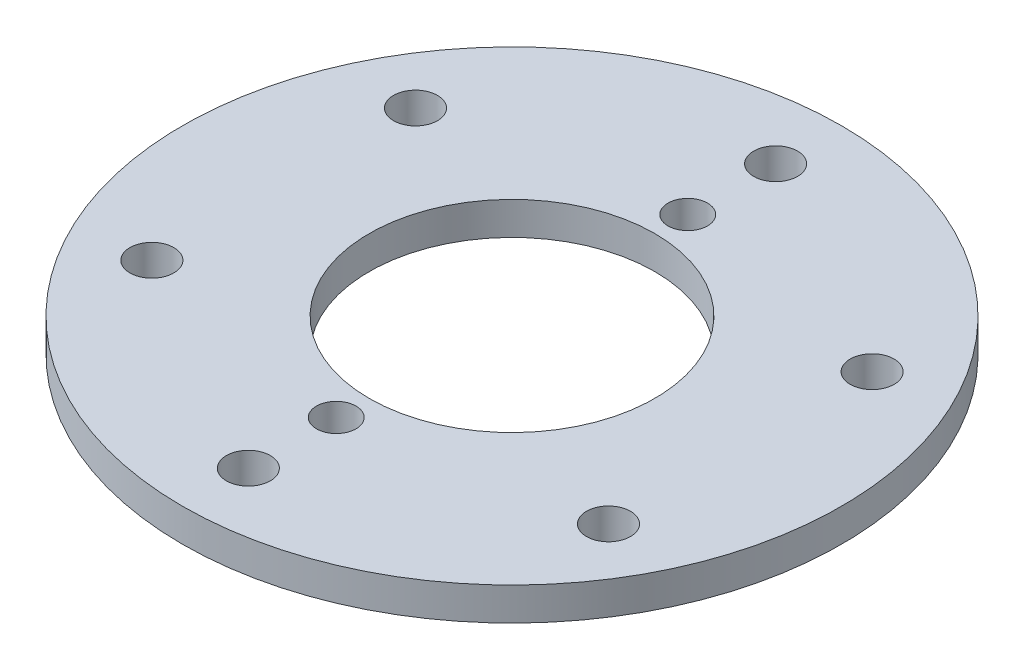
ISO-10303-21;
HEADER;
FILE_DESCRIPTION(('STEP AP214'),'2;1');
FILE_NAME('part.step','',(''),(''),'','','');
FILE_SCHEMA(('AUTOMOTIVE_DESIGN { 1 0 10303 214 1 1 1 1 }'));
ENDSEC;
DATA;
#1=APPLICATION_CONTEXT('core data for automotive mechanical design processes');
#2=APPLICATION_PROTOCOL_DEFINITION('international standard','automotive_design',2000,#1);
#3=PRODUCT_CONTEXT('',#1,'mechanical');
#4=PRODUCT('Part','Part','',(#3));
#5=PRODUCT_RELATED_PRODUCT_CATEGORY('part','',(#4));
#6=PRODUCT_DEFINITION_FORMATION('','',#4);
#7=PRODUCT_DEFINITION_CONTEXT('part definition',#1,'design');
#8=PRODUCT_DEFINITION('design','',#6,#7);
#9=PRODUCT_DEFINITION_SHAPE('','',#8);
#10=(LENGTH_UNIT() NAMED_UNIT(*) SI_UNIT(.MILLI.,.METRE.));
#11=(NAMED_UNIT(*) PLANE_ANGLE_UNIT() SI_UNIT($,.RADIAN.));
#12=(NAMED_UNIT(*) SI_UNIT($,.STERADIAN.) SOLID_ANGLE_UNIT());
#13=UNCERTAINTY_MEASURE_WITH_UNIT(LENGTH_MEASURE(1.E-05),#10,'distance_accuracy_value','');
#14=(GEOMETRIC_REPRESENTATION_CONTEXT(3) GLOBAL_UNCERTAINTY_ASSIGNED_CONTEXT((#13)) GLOBAL_UNIT_ASSIGNED_CONTEXT((#10,
#11,#12)) REPRESENTATION_CONTEXT('',''));
#15=CARTESIAN_POINT('',(0.,0.,0.));
#16=DIRECTION('',(0.,0.,1.));
#17=DIRECTION('',(1.,0.,0.));
#18=AXIS2_PLACEMENT_3D('',#15,#16,#17);
#19=CARTESIAN_POINT('',(0.,15.,0.));
#20=DIRECTION('',(0.,1.,0.));
#21=DIRECTION('',(0.,0.,1.));
#22=AXIS2_PLACEMENT_3D('',#19,#20,#21);
#23=PLANE('',#22);
#24=CARTESIAN_POINT('',(-103.923048454133,15.,-60.));
#25=DIRECTION('',(0.,1.,0.));
#26=DIRECTION('',(0.,0.,1.));
#27=AXIS2_PLACEMENT_3D('',#24,#25,#26);
#28=CIRCLE('',#27,9.99999999999999);
#29=CARTESIAN_POINT('',(-103.923048454133,15.,-50.));
#30=VERTEX_POINT('',#29);
#31=EDGE_CURVE('E89',#30,#30,#28,.T.);
#32=ORIENTED_EDGE('',*,*,#31,.F.);
#33=EDGE_LOOP('',(#32));
#34=FACE_BOUND('',#33,.T.);
#35=CARTESIAN_POINT('',(0.,15.,120.));
#36=DIRECTION('',(0.,1.,0.));
#37=DIRECTION('',(0.,0.,1.));
#38=AXIS2_PLACEMENT_3D('',#35,#36,#37);
#39=CIRCLE('',#38,9.99999999999999);
#40=CARTESIAN_POINT('',(0.,15.,130.));
#41=VERTEX_POINT('',#40);
#42=EDGE_CURVE('E77',#41,#41,#39,.T.);
#43=ORIENTED_EDGE('',*,*,#42,.F.);
#44=EDGE_LOOP('',(#43));
#45=FACE_BOUND('',#44,.T.);
#46=CARTESIAN_POINT('',(103.923048454133,15.,-60.));
#47=DIRECTION('',(0.,1.,0.));
#48=DIRECTION('',(0.,0.,1.));
#49=AXIS2_PLACEMENT_3D('',#46,#47,#48);
#50=CIRCLE('',#49,9.99999999999999);
#51=CARTESIAN_POINT('',(103.923048454133,15.,-50.));
#52=VERTEX_POINT('',#51);
#53=EDGE_CURVE('E65',#52,#52,#50,.T.);
#54=ORIENTED_EDGE('',*,*,#53,.F.);
#55=EDGE_LOOP('',(#54));
#56=FACE_BOUND('',#55,.T.);
#57=CARTESIAN_POINT('',(0.,15.,-120.));
#58=DIRECTION('',(0.,1.,0.));
#59=DIRECTION('',(0.,0.,1.));
#60=AXIS2_PLACEMENT_3D('',#57,#58,#59);
#61=CIRCLE('',#60,10.);
#62=CARTESIAN_POINT('',(0.,15.,-110.));
#63=VERTEX_POINT('',#62);
#64=EDGE_CURVE('E53',#63,#63,#61,.T.);
#65=ORIENTED_EDGE('',*,*,#64,.F.);
#66=EDGE_LOOP('',(#65));
#67=FACE_BOUND('',#66,.T.);
#68=CARTESIAN_POINT('',(0.,15.,0.));
#69=DIRECTION('',(0.,1.,0.));
#70=DIRECTION('',(0.,0.,1.));
#71=AXIS2_PLACEMENT_3D('',#68,#69,#70);
#72=CIRCLE('',#71,150.);
#73=CARTESIAN_POINT('',(0.,15.,150.));
#74=VERTEX_POINT('',#73);
#75=EDGE_CURVE('E10',#74,#74,#72,.T.);
#76=ORIENTED_EDGE('',*,*,#75,.T.);
#77=EDGE_LOOP('',(#76));
#78=FACE_BOUND('',#77,.T.);
#79=CARTESIAN_POINT('',(0.,15.,0.));
#80=DIRECTION('',(0.,1.,0.));
#81=DIRECTION('',(0.,0.,1.));
#82=AXIS2_PLACEMENT_3D('',#79,#80,#81);
#83=CIRCLE('',#82,65.);
#84=CARTESIAN_POINT('',(0.,15.,65.));
#85=VERTEX_POINT('',#84);
#86=EDGE_CURVE('E48',#85,#85,#83,.T.);
#87=ORIENTED_EDGE('',*,*,#86,.F.);
#88=EDGE_LOOP('',(#87));
#89=FACE_BOUND('',#88,.T.);
#90=CARTESIAN_POINT('',(0.,15.,80.));
#91=DIRECTION('',(0.,1.,0.));
#92=DIRECTION('',(0.,0.,-1.));
#93=AXIS2_PLACEMENT_3D('',#90,#91,#92);
#94=CIRCLE('',#93,9.);
#95=CARTESIAN_POINT('',(0.,15.,71.));
#96=VERTEX_POINT('',#95);
#97=EDGE_CURVE('E59',#96,#96,#94,.T.);
#98=ORIENTED_EDGE('',*,*,#97,.F.);
#99=EDGE_LOOP('',(#98));
#100=FACE_BOUND('',#99,.T.);
#101=CARTESIAN_POINT('',(103.923048454133,15.,60.));
#102=DIRECTION('',(0.,1.,0.));
#103=DIRECTION('',(0.,0.,1.));
#104=AXIS2_PLACEMENT_3D('',#101,#102,#103);
#105=CIRCLE('',#104,9.99999999999999);
#106=CARTESIAN_POINT('',(103.923048454133,15.,70.));
#107=VERTEX_POINT('',#106);
#108=EDGE_CURVE('E71',#107,#107,#105,.T.);
#109=ORIENTED_EDGE('',*,*,#108,.F.);
#110=EDGE_LOOP('',(#109));
#111=FACE_BOUND('',#110,.T.);
#112=CARTESIAN_POINT('',(-103.923048454133,15.,60.0000000000001));
#113=DIRECTION('',(0.,1.,0.));
#114=DIRECTION('',(0.,0.,1.));
#115=AXIS2_PLACEMENT_3D('',#112,#113,#114);
#116=CIRCLE('',#115,9.99999999999998);
#117=CARTESIAN_POINT('',(-103.923048454133,15.,70.));
#118=VERTEX_POINT('',#117);
#119=EDGE_CURVE('E83',#118,#118,#116,.T.);
#120=ORIENTED_EDGE('',*,*,#119,.F.);
#121=EDGE_LOOP('',(#120));
#122=FACE_BOUND('',#121,.T.);
#123=CARTESIAN_POINT('',(0.,15.,-80.));
#124=DIRECTION('',(0.,1.,0.));
#125=DIRECTION('',(0.,0.,1.));
#126=AXIS2_PLACEMENT_3D('',#123,#124,#125);
#127=CIRCLE('',#126,9.);
#128=CARTESIAN_POINT('',(0.,15.,-71.));
#129=VERTEX_POINT('',#128);
#130=EDGE_CURVE('E95',#129,#129,#127,.T.);
#131=ORIENTED_EDGE('',*,*,#130,.F.);
#132=EDGE_LOOP('',(#131));
#133=FACE_BOUND('',#132,.T.);
#134=ADVANCED_FACE('F37',(#34,#45,#56,#67,#78,#89,#100,#111,#122,#133),#23,.T.);
#135=CARTESIAN_POINT('',(0.,0.,0.));
#136=DIRECTION('',(0.,1.,0.));
#137=DIRECTION('',(0.,0.,1.));
#138=AXIS2_PLACEMENT_3D('',#135,#136,#137);
#139=PLANE('',#138);
#140=CARTESIAN_POINT('',(0.,0.,0.));
#141=DIRECTION('',(0.,1.,0.));
#142=DIRECTION('',(0.,0.,1.));
#143=AXIS2_PLACEMENT_3D('',#140,#141,#142);
#144=CIRCLE('',#143,150.);
#145=CARTESIAN_POINT('',(0.,0.,150.));
#146=VERTEX_POINT('',#145);
#147=EDGE_CURVE('E41',#146,#146,#144,.T.);
#148=ORIENTED_EDGE('',*,*,#147,.F.);
#149=EDGE_LOOP('',(#148));
#150=FACE_BOUND('',#149,.T.);
#151=CARTESIAN_POINT('',(0.,0.,0.));
#152=DIRECTION('',(0.,1.,0.));
#153=DIRECTION('',(0.,0.,1.));
#154=AXIS2_PLACEMENT_3D('',#151,#152,#153);
#155=CIRCLE('',#154,65.);
#156=CARTESIAN_POINT('',(0.,0.,65.));
#157=VERTEX_POINT('',#156);
#158=EDGE_CURVE('E50',#157,#157,#155,.T.);
#159=ORIENTED_EDGE('',*,*,#158,.T.);
#160=EDGE_LOOP('',(#159));
#161=FACE_BOUND('',#160,.T.);
#162=CARTESIAN_POINT('',(0.,0.,-120.));
#163=DIRECTION('',(0.,1.,0.));
#164=DIRECTION('',(0.,0.,1.));
#165=AXIS2_PLACEMENT_3D('',#162,#163,#164);
#166=CIRCLE('',#165,10.);
#167=CARTESIAN_POINT('',(0.,0.,-110.));
#168=VERTEX_POINT('',#167);
#169=EDGE_CURVE('E56',#168,#168,#166,.T.);
#170=ORIENTED_EDGE('',*,*,#169,.T.);
#171=EDGE_LOOP('',(#170));
#172=FACE_BOUND('',#171,.T.);
#173=CARTESIAN_POINT('',(0.,0.,80.));
#174=DIRECTION('',(0.,1.,0.));
#175=DIRECTION('',(0.,0.,-1.));
#176=AXIS2_PLACEMENT_3D('',#173,#174,#175);
#177=CIRCLE('',#176,9.);
#178=CARTESIAN_POINT('',(0.,0.,71.));
#179=VERTEX_POINT('',#178);
#180=EDGE_CURVE('E62',#179,#179,#177,.T.);
#181=ORIENTED_EDGE('',*,*,#180,.T.);
#182=EDGE_LOOP('',(#181));
#183=FACE_BOUND('',#182,.T.);
#184=CARTESIAN_POINT('',(103.923048454133,0.,-60.));
#185=DIRECTION('',(0.,1.,0.));
#186=DIRECTION('',(0.,0.,1.));
#187=AXIS2_PLACEMENT_3D('',#184,#185,#186);
#188=CIRCLE('',#187,9.99999999999999);
#189=CARTESIAN_POINT('',(103.923048454133,0.,-50.));
#190=VERTEX_POINT('',#189);
#191=EDGE_CURVE('E68',#190,#190,#188,.T.);
#192=ORIENTED_EDGE('',*,*,#191,.T.);
#193=EDGE_LOOP('',(#192));
#194=FACE_BOUND('',#193,.T.);
#195=CARTESIAN_POINT('',(103.923048454133,0.,60.));
#196=DIRECTION('',(0.,1.,0.));
#197=DIRECTION('',(0.,0.,1.));
#198=AXIS2_PLACEMENT_3D('',#195,#196,#197);
#199=CIRCLE('',#198,9.99999999999999);
#200=CARTESIAN_POINT('',(103.923048454133,0.,70.));
#201=VERTEX_POINT('',#200);
#202=EDGE_CURVE('E74',#201,#201,#199,.T.);
#203=ORIENTED_EDGE('',*,*,#202,.T.);
#204=EDGE_LOOP('',(#203));
#205=FACE_BOUND('',#204,.T.);
#206=CARTESIAN_POINT('',(0.,0.,120.));
#207=DIRECTION('',(0.,1.,0.));
#208=DIRECTION('',(0.,0.,1.));
#209=AXIS2_PLACEMENT_3D('',#206,#207,#208);
#210=CIRCLE('',#209,9.99999999999999);
#211=CARTESIAN_POINT('',(0.,0.,130.));
#212=VERTEX_POINT('',#211);
#213=EDGE_CURVE('E80',#212,#212,#210,.T.);
#214=ORIENTED_EDGE('',*,*,#213,.T.);
#215=EDGE_LOOP('',(#214));
#216=FACE_BOUND('',#215,.T.);
#217=CARTESIAN_POINT('',(-103.923048454133,0.,60.0000000000001));
#218=DIRECTION('',(0.,1.,0.));
#219=DIRECTION('',(0.,0.,1.));
#220=AXIS2_PLACEMENT_3D('',#217,#218,#219);
#221=CIRCLE('',#220,9.99999999999998);
#222=CARTESIAN_POINT('',(-103.923048454133,0.,70.));
#223=VERTEX_POINT('',#222);
#224=EDGE_CURVE('E86',#223,#223,#221,.T.);
#225=ORIENTED_EDGE('',*,*,#224,.T.);
#226=EDGE_LOOP('',(#225));
#227=FACE_BOUND('',#226,.T.);
#228=CARTESIAN_POINT('',(-103.923048454133,0.,-60.));
#229=DIRECTION('',(0.,1.,0.));
#230=DIRECTION('',(0.,0.,1.));
#231=AXIS2_PLACEMENT_3D('',#228,#229,#230);
#232=CIRCLE('',#231,9.99999999999999);
#233=CARTESIAN_POINT('',(-103.923048454133,0.,-50.));
#234=VERTEX_POINT('',#233);
#235=EDGE_CURVE('E92',#234,#234,#232,.T.);
#236=ORIENTED_EDGE('',*,*,#235,.T.);
#237=EDGE_LOOP('',(#236));
#238=FACE_BOUND('',#237,.T.);
#239=CARTESIAN_POINT('',(0.,0.,-80.));
#240=DIRECTION('',(0.,1.,0.));
#241=DIRECTION('',(0.,0.,1.));
#242=AXIS2_PLACEMENT_3D('',#239,#240,#241);
#243=CIRCLE('',#242,9.);
#244=CARTESIAN_POINT('',(0.,0.,-71.));
#245=VERTEX_POINT('',#244);
#246=EDGE_CURVE('E98',#245,#245,#243,.T.);
#247=ORIENTED_EDGE('',*,*,#246,.T.);
#248=EDGE_LOOP('',(#247));
#249=FACE_BOUND('',#248,.T.);
#250=ADVANCED_FACE('F108',(#150,#161,#172,#183,#194,#205,#216,#227,#238,#249),#139,.F.);
#251=CARTESIAN_POINT('',(0.,15.,0.));
#252=DIRECTION('',(0.,-1.,0.));
#253=DIRECTION('',(0.,0.,-1.));
#254=AXIS2_PLACEMENT_3D('',#251,#252,#253);
#255=CYLINDRICAL_SURFACE('',#254,150.);
#256=ORIENTED_EDGE('',*,*,#75,.F.);
#257=EDGE_LOOP('',(#256));
#258=FACE_BOUND('',#257,.T.);
#259=ORIENTED_EDGE('',*,*,#147,.T.);
#260=EDGE_LOOP('',(#259));
#261=FACE_BOUND('',#260,.T.);
#262=ADVANCED_FACE('F39',(#258,#261),#255,.T.);
#263=CARTESIAN_POINT('',(0.,15.,0.));
#264=DIRECTION('',(0.,-1.,0.));
#265=DIRECTION('',(0.,0.,-1.));
#266=AXIS2_PLACEMENT_3D('',#263,#264,#265);
#267=CYLINDRICAL_SURFACE('',#266,65.);
#268=ORIENTED_EDGE('',*,*,#86,.T.);
#269=EDGE_LOOP('',(#268));
#270=FACE_BOUND('',#269,.T.);
#271=ORIENTED_EDGE('',*,*,#158,.F.);
#272=EDGE_LOOP('',(#271));
#273=FACE_BOUND('',#272,.T.);
#274=ADVANCED_FACE('F118',(#270,#273),#267,.F.);
#275=CARTESIAN_POINT('',(0.,15.,-120.));
#276=DIRECTION('',(0.,-1.,0.));
#277=DIRECTION('',(0.,0.,-1.));
#278=AXIS2_PLACEMENT_3D('',#275,#276,#277);
#279=CYLINDRICAL_SURFACE('',#278,10.);
#280=ORIENTED_EDGE('',*,*,#64,.T.);
#281=EDGE_LOOP('',(#280));
#282=FACE_BOUND('',#281,.T.);
#283=ORIENTED_EDGE('',*,*,#169,.F.);
#284=EDGE_LOOP('',(#283));
#285=FACE_BOUND('',#284,.T.);
#286=ADVANCED_FACE('F121',(#282,#285),#279,.F.);
#287=CARTESIAN_POINT('',(0.,15.,80.));
#288=DIRECTION('',(0.,-1.,0.));
#289=DIRECTION('',(0.,0.,-1.));
#290=AXIS2_PLACEMENT_3D('',#287,#288,#289);
#291=CYLINDRICAL_SURFACE('',#290,9.);
#292=ORIENTED_EDGE('',*,*,#97,.T.);
#293=EDGE_LOOP('',(#292));
#294=FACE_BOUND('',#293,.T.);
#295=ORIENTED_EDGE('',*,*,#180,.F.);
#296=EDGE_LOOP('',(#295));
#297=FACE_BOUND('',#296,.T.);
#298=ADVANCED_FACE('F125',(#294,#297),#291,.F.);
#299=CARTESIAN_POINT('',(103.923048454133,15.,-60.));
#300=DIRECTION('',(0.,-1.,0.));
#301=DIRECTION('',(0.,0.,-1.));
#302=AXIS2_PLACEMENT_3D('',#299,#300,#301);
#303=CYLINDRICAL_SURFACE('',#302,9.99999999999999);
#304=ORIENTED_EDGE('',*,*,#53,.T.);
#305=EDGE_LOOP('',(#304));
#306=FACE_BOUND('',#305,.T.);
#307=ORIENTED_EDGE('',*,*,#191,.F.);
#308=EDGE_LOOP('',(#307));
#309=FACE_BOUND('',#308,.T.);
#310=ADVANCED_FACE('F129',(#306,#309),#303,.F.);
#311=CARTESIAN_POINT('',(103.923048454133,15.,60.));
#312=DIRECTION('',(0.,-1.,0.));
#313=DIRECTION('',(0.,0.,-1.));
#314=AXIS2_PLACEMENT_3D('',#311,#312,#313);
#315=CYLINDRICAL_SURFACE('',#314,9.99999999999999);
#316=ORIENTED_EDGE('',*,*,#108,.T.);
#317=EDGE_LOOP('',(#316));
#318=FACE_BOUND('',#317,.T.);
#319=ORIENTED_EDGE('',*,*,#202,.F.);
#320=EDGE_LOOP('',(#319));
#321=FACE_BOUND('',#320,.T.);
#322=ADVANCED_FACE('F133',(#318,#321),#315,.F.);
#323=CARTESIAN_POINT('',(0.,15.,120.));
#324=DIRECTION('',(0.,-1.,0.));
#325=DIRECTION('',(0.,0.,-1.));
#326=AXIS2_PLACEMENT_3D('',#323,#324,#325);
#327=CYLINDRICAL_SURFACE('',#326,9.99999999999999);
#328=ORIENTED_EDGE('',*,*,#42,.T.);
#329=EDGE_LOOP('',(#328));
#330=FACE_BOUND('',#329,.T.);
#331=ORIENTED_EDGE('',*,*,#213,.F.);
#332=EDGE_LOOP('',(#331));
#333=FACE_BOUND('',#332,.T.);
#334=ADVANCED_FACE('F137',(#330,#333),#327,.F.);
#335=CARTESIAN_POINT('',(-103.923048454133,15.,60.0000000000001));
#336=DIRECTION('',(0.,-1.,0.));
#337=DIRECTION('',(0.,0.,-1.));
#338=AXIS2_PLACEMENT_3D('',#335,#336,#337);
#339=CYLINDRICAL_SURFACE('',#338,9.99999999999998);
#340=ORIENTED_EDGE('',*,*,#119,.T.);
#341=EDGE_LOOP('',(#340));
#342=FACE_BOUND('',#341,.T.);
#343=ORIENTED_EDGE('',*,*,#224,.F.);
#344=EDGE_LOOP('',(#343));
#345=FACE_BOUND('',#344,.T.);
#346=ADVANCED_FACE('F141',(#342,#345),#339,.F.);
#347=CARTESIAN_POINT('',(-103.923048454133,15.,-60.));
#348=DIRECTION('',(0.,-1.,0.));
#349=DIRECTION('',(0.,0.,-1.));
#350=AXIS2_PLACEMENT_3D('',#347,#348,#349);
#351=CYLINDRICAL_SURFACE('',#350,9.99999999999999);
#352=ORIENTED_EDGE('',*,*,#31,.T.);
#353=EDGE_LOOP('',(#352));
#354=FACE_BOUND('',#353,.T.);
#355=ORIENTED_EDGE('',*,*,#235,.F.);
#356=EDGE_LOOP('',(#355));
#357=FACE_BOUND('',#356,.T.);
#358=ADVANCED_FACE('F145',(#354,#357),#351,.F.);
#359=CARTESIAN_POINT('',(0.,15.,-80.));
#360=DIRECTION('',(0.,-1.,0.));
#361=DIRECTION('',(0.,0.,-1.));
#362=AXIS2_PLACEMENT_3D('',#359,#360,#361);
#363=CYLINDRICAL_SURFACE('',#362,9.);
#364=ORIENTED_EDGE('',*,*,#130,.T.);
#365=EDGE_LOOP('',(#364));
#366=FACE_BOUND('',#365,.T.);
#367=ORIENTED_EDGE('',*,*,#246,.F.);
#368=EDGE_LOOP('',(#367));
#369=FACE_BOUND('',#368,.T.);
#370=ADVANCED_FACE('F104',(#366,#369),#363,.F.);
#371=CLOSED_SHELL('',(#134,#250,#262,#274,#286,#298,#310,#322,#334,#346,#358,#370));
#372=MANIFOLD_SOLID_BREP('B2',#371);
#373=ADVANCED_BREP_SHAPE_REPRESENTATION('',(#18,#372),#14);
#374=SHAPE_DEFINITION_REPRESENTATION(#9,#373);
ENDSEC;
END-ISO-10303-21;
